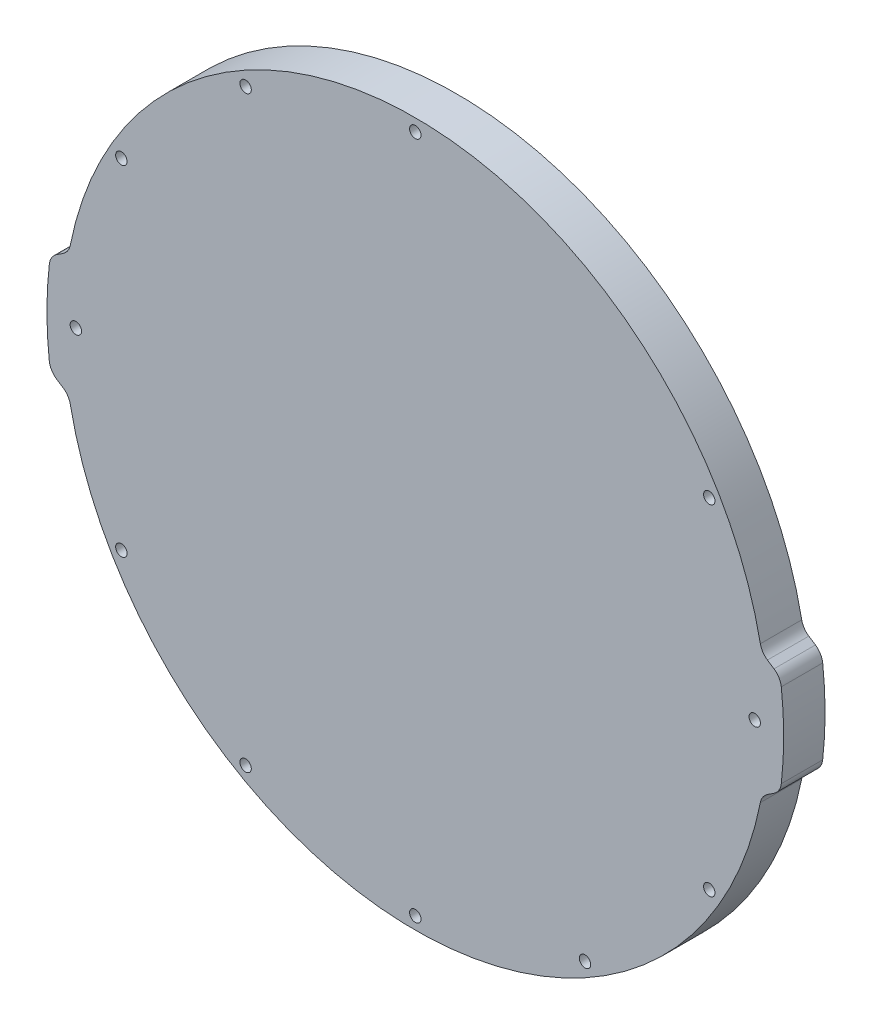
ISO-10303-21;
HEADER;
FILE_DESCRIPTION(('STEP AP214'),'2;1');
FILE_NAME('part.step','',(''),(''),'','','');
FILE_SCHEMA(('AUTOMOTIVE_DESIGN { 1 0 10303 214 1 1 1 1 }'));
ENDSEC;
DATA;
#1=APPLICATION_CONTEXT('core data for automotive mechanical design processes');
#2=APPLICATION_PROTOCOL_DEFINITION('international standard','automotive_design',2000,#1);
#3=PRODUCT_CONTEXT('',#1,'mechanical');
#4=PRODUCT('Part','Part','',(#3));
#5=PRODUCT_RELATED_PRODUCT_CATEGORY('part','',(#4));
#6=PRODUCT_DEFINITION_FORMATION('','',#4);
#7=PRODUCT_DEFINITION_CONTEXT('part definition',#1,'design');
#8=PRODUCT_DEFINITION('design','',#6,#7);
#9=PRODUCT_DEFINITION_SHAPE('','',#8);
#10=(LENGTH_UNIT() NAMED_UNIT(*) SI_UNIT(.MILLI.,.METRE.));
#11=(NAMED_UNIT(*) PLANE_ANGLE_UNIT() SI_UNIT($,.RADIAN.));
#12=(NAMED_UNIT(*) SI_UNIT($,.STERADIAN.) SOLID_ANGLE_UNIT());
#13=UNCERTAINTY_MEASURE_WITH_UNIT(LENGTH_MEASURE(1.E-05),#10,'distance_accuracy_value','');
#14=(GEOMETRIC_REPRESENTATION_CONTEXT(3) GLOBAL_UNCERTAINTY_ASSIGNED_CONTEXT((#13)) GLOBAL_UNIT_ASSIGNED_CONTEXT((#10,
#11,#12)) REPRESENTATION_CONTEXT('',''));
#15=CARTESIAN_POINT('',(0.,0.,0.));
#16=DIRECTION('',(0.,0.,1.));
#17=DIRECTION('',(1.,0.,0.));
#18=AXIS2_PLACEMENT_3D('',#15,#16,#17);
#19=CARTESIAN_POINT('',(-41.2570134560101,-62.1784177450905,6.35));
#20=DIRECTION('',(0.552887280799095,0.833256055921937,0.));
#21=DIRECTION('',(-0.833256055921937,0.552887280799095,0.));
#22=AXIS2_PLACEMENT_3D('',#19,#20,#21);
#23=PLANE('',#22);
#24=DIRECTION('',(0.833256055921937,-0.552887280799095,0.));
#25=VECTOR('',#24,1.);
#26=CARTESIAN_POINT('',(-41.2570134560101,-62.1784177450905,6.35));
#27=LINE('',#26,#25);
#28=CARTESIAN_POINT('',(-110.056160405221,-16.5283765510182,6.35));
#29=VERTEX_POINT('',#28);
#30=CARTESIAN_POINT('',(-108.039916516928,-17.8662073329294,6.35));
#31=VERTEX_POINT('',#30);
#32=EDGE_CURVE('E397',#29,#31,#27,.T.);
#33=ORIENTED_EDGE('',*,*,#32,.F.);
#34=DIRECTION('',(0.,0.,-1.));
#35=VECTOR('',#34,1.);
#36=CARTESIAN_POINT('',(-110.056160405221,-16.5283765510182,6.35));
#37=LINE('',#36,#35);
#38=CARTESIAN_POINT('',(-110.056160405221,-16.5283765510182,-6.35));
#39=VERTEX_POINT('',#38);
#40=EDGE_CURVE('E233',#29,#39,#37,.T.);
#41=ORIENTED_EDGE('',*,*,#40,.T.);
#42=DIRECTION('',(0.833256055921937,-0.552887280799095,0.));
#43=VECTOR('',#42,1.);
#44=CARTESIAN_POINT('',(-41.2570134560101,-62.1784177450905,-6.35));
#45=LINE('',#44,#43);
#46=CARTESIAN_POINT('',(-108.039916516928,-17.8662073329294,-6.35));
#47=VERTEX_POINT('',#46);
#48=EDGE_CURVE('E358',#39,#47,#45,.T.);
#49=ORIENTED_EDGE('',*,*,#48,.T.);
#50=DIRECTION('',(0.,0.,1.));
#51=VECTOR('',#50,1.);
#52=CARTESIAN_POINT('',(-108.039916516928,-17.8662073329294,6.35));
#53=LINE('',#52,#51);
#54=EDGE_CURVE('E230',#47,#31,#53,.T.);
#55=ORIENTED_EDGE('',*,*,#54,.T.);
#56=EDGE_LOOP('',(#33,#41,#49,#55));
#57=FACE_BOUND('',#56,.T.);
#58=ADVANCED_FACE('F43',(#57),#23,.F.);
#59=CARTESIAN_POINT('',(0.,0.,6.35));
#60=DIRECTION('',(0.,0.,-1.));
#61=DIRECTION('',(-1.,0.,0.));
#62=AXIS2_PLACEMENT_3D('',#59,#60,#61);
#63=CYLINDRICAL_SURFACE('',#62,107.95);
#64=CARTESIAN_POINT('',(0.,0.,6.35));
#65=DIRECTION('',(0.,0.,1.));
#66=DIRECTION('',(1.,0.,0.));
#67=AXIS2_PLACEMENT_3D('',#64,#65,#66);
#68=CIRCLE('',#67,107.95);
#69=CARTESIAN_POINT('',(-105.866625076269,-21.1059279578212,6.35));
#70=VERTEX_POINT('',#69);
#71=CARTESIAN_POINT('',(105.866625076269,-21.1059279578212,6.35));
#72=VERTEX_POINT('',#71);
#73=EDGE_CURVE('E391',#70,#72,#68,.T.);
#74=ORIENTED_EDGE('',*,*,#73,.F.);
#75=DIRECTION('',(0.,0.,-1.));
#76=VECTOR('',#75,1.);
#77=CARTESIAN_POINT('',(-105.866625076269,-21.1059279578212,6.35));
#78=LINE('',#77,#76);
#79=CARTESIAN_POINT('',(-105.866625076269,-21.1059279578212,-6.35));
#80=VERTEX_POINT('',#79);
#81=EDGE_CURVE('E240',#70,#80,#78,.T.);
#82=ORIENTED_EDGE('',*,*,#81,.T.);
#83=CARTESIAN_POINT('',(0.,0.,-6.35));
#84=DIRECTION('',(0.,0.,1.));
#85=DIRECTION('',(1.,0.,0.));
#86=AXIS2_PLACEMENT_3D('',#83,#84,#85);
#87=CIRCLE('',#86,107.95);
#88=CARTESIAN_POINT('',(105.866625076269,-21.1059279578212,-6.35));
#89=VERTEX_POINT('',#88);
#90=EDGE_CURVE('E362',#80,#89,#87,.T.);
#91=ORIENTED_EDGE('',*,*,#90,.T.);
#92=DIRECTION('',(0.,0.,-1.));
#93=VECTOR('',#92,1.);
#94=CARTESIAN_POINT('',(105.866625076269,-21.1059279578212,6.35));
#95=LINE('',#94,#93);
#96=EDGE_CURVE('E237',#89,#72,#95,.F.);
#97=ORIENTED_EDGE('',*,*,#96,.T.);
#98=EDGE_LOOP('',(#74,#82,#91,#97));
#99=FACE_BOUND('',#98,.T.);
#100=ADVANCED_FACE('F485',(#99),#63,.T.);
#101=CARTESIAN_POINT('',(41.2570134560101,-62.1784177450905,6.35));
#102=DIRECTION('',(0.552887280799095,-0.833256055921937,0.));
#103=DIRECTION('',(0.833256055921937,0.552887280799095,0.));
#104=AXIS2_PLACEMENT_3D('',#101,#102,#103);
#105=PLANE('',#104);
#106=DIRECTION('',(-0.833256055921937,-0.552887280799095,0.));
#107=VECTOR('',#106,1.);
#108=CARTESIAN_POINT('',(41.2570134560101,-62.1784177450905,-6.35));
#109=LINE('',#108,#107);
#110=CARTESIAN_POINT('',(110.056160405221,-16.5283765510182,-6.35));
#111=VERTEX_POINT('',#110);
#112=CARTESIAN_POINT('',(108.039916516928,-17.8662073329294,-6.35));
#113=VERTEX_POINT('',#112);
#114=EDGE_CURVE('E366',#111,#113,#109,.T.);
#115=ORIENTED_EDGE('',*,*,#114,.F.);
#116=DIRECTION('',(0.,0.,1.));
#117=VECTOR('',#116,1.);
#118=CARTESIAN_POINT('',(110.056160405221,-16.5283765510182,6.35));
#119=LINE('',#118,#117);
#120=CARTESIAN_POINT('',(110.056160405221,-16.5283765510182,6.35));
#121=VERTEX_POINT('',#120);
#122=EDGE_CURVE('E255',#111,#121,#119,.T.);
#123=ORIENTED_EDGE('',*,*,#122,.T.);
#124=DIRECTION('',(-0.833256055921937,-0.552887280799095,0.));
#125=VECTOR('',#124,1.);
#126=CARTESIAN_POINT('',(41.2570134560101,-62.1784177450905,6.35));
#127=LINE('',#126,#125);
#128=CARTESIAN_POINT('',(108.039916516928,-17.8662073329294,6.35));
#129=VERTEX_POINT('',#128);
#130=EDGE_CURVE('E388',#121,#129,#127,.T.);
#131=ORIENTED_EDGE('',*,*,#130,.T.);
#132=DIRECTION('',(0.,0.,-1.));
#133=VECTOR('',#132,1.);
#134=CARTESIAN_POINT('',(108.039916516928,-17.8662073329294,6.35));
#135=LINE('',#134,#133);
#136=EDGE_CURVE('E251',#129,#113,#135,.T.);
#137=ORIENTED_EDGE('',*,*,#136,.T.);
#138=EDGE_LOOP('',(#115,#123,#131,#137));
#139=FACE_BOUND('',#138,.T.);
#140=ADVANCED_FACE('F491',(#139),#105,.T.);
#141=CARTESIAN_POINT('',(0.,0.,6.35));
#142=DIRECTION('',(0.,0.,-1.));
#143=DIRECTION('',(-1.,0.,0.));
#144=AXIS2_PLACEMENT_3D('',#141,#142,#143);
#145=CYLINDRICAL_SURFACE('',#144,113.03);
#146=CARTESIAN_POINT('',(0.,0.,6.35));
#147=DIRECTION('',(0.,0.,1.));
#148=DIRECTION('',(1.,0.,0.));
#149=AXIS2_PLACEMENT_3D('',#146,#147,#148);
#150=CIRCLE('',#149,113.03);
#151=CARTESIAN_POINT('',(112.294433866704,-12.8740445298493,6.35));
#152=VERTEX_POINT('',#151);
#153=CARTESIAN_POINT('',(112.294433866704,12.8740445298493,6.35));
#154=VERTEX_POINT('',#153);
#155=EDGE_CURVE('E308',#152,#154,#150,.T.);
#156=ORIENTED_EDGE('',*,*,#155,.F.);
#157=DIRECTION('',(0.,0.,-1.));
#158=VECTOR('',#157,1.);
#159=CARTESIAN_POINT('',(112.294433866704,-12.8740445298493,6.35));
#160=LINE('',#159,#158);
#161=CARTESIAN_POINT('',(112.294433866704,-12.8740445298493,-6.35));
#162=VERTEX_POINT('',#161);
#163=EDGE_CURVE('E247',#152,#162,#160,.T.);
#164=ORIENTED_EDGE('',*,*,#163,.T.);
#165=CARTESIAN_POINT('',(0.,0.,-6.35));
#166=DIRECTION('',(0.,0.,1.));
#167=DIRECTION('',(1.,0.,0.));
#168=AXIS2_PLACEMENT_3D('',#165,#166,#167);
#169=CIRCLE('',#168,113.03);
#170=CARTESIAN_POINT('',(112.294433866704,12.8740445298493,-6.35));
#171=VERTEX_POINT('',#170);
#172=EDGE_CURVE('E295',#162,#171,#169,.T.);
#173=ORIENTED_EDGE('',*,*,#172,.T.);
#174=DIRECTION('',(0.,0.,-1.));
#175=VECTOR('',#174,1.);
#176=CARTESIAN_POINT('',(112.294433866704,12.8740445298493,6.35));
#177=LINE('',#176,#175);
#178=EDGE_CURVE('E244',#171,#154,#177,.F.);
#179=ORIENTED_EDGE('',*,*,#178,.T.);
#180=EDGE_LOOP('',(#156,#164,#173,#179));
#181=FACE_BOUND('',#180,.T.);
#182=ADVANCED_FACE('F377',(#181),#145,.T.);
#183=CARTESIAN_POINT('',(41.2570134560101,62.1784177450905,6.35));
#184=DIRECTION('',(-0.552887280799095,-0.833256055921937,0.));
#185=DIRECTION('',(0.833256055921937,-0.552887280799095,0.));
#186=AXIS2_PLACEMENT_3D('',#183,#184,#185);
#187=PLANE('',#186);
#188=DIRECTION('',(-0.833256055921937,0.552887280799095,0.));
#189=VECTOR('',#188,1.);
#190=CARTESIAN_POINT('',(41.2570134560101,62.1784177450905,6.35));
#191=LINE('',#190,#189);
#192=CARTESIAN_POINT('',(110.056160405221,16.5283765510182,6.35));
#193=VERTEX_POINT('',#192);
#194=CARTESIAN_POINT('',(108.039916516928,17.8662073329294,6.35));
#195=VERTEX_POINT('',#194);
#196=EDGE_CURVE('E302',#193,#195,#191,.T.);
#197=ORIENTED_EDGE('',*,*,#196,.F.);
#198=DIRECTION('',(0.,0.,-1.));
#199=VECTOR('',#198,1.);
#200=CARTESIAN_POINT('',(110.056160405221,16.5283765510182,6.35));
#201=LINE('',#200,#199);
#202=CARTESIAN_POINT('',(110.056160405221,16.5283765510182,-6.35));
#203=VERTEX_POINT('',#202);
#204=EDGE_CURVE('E261',#193,#203,#201,.T.);
#205=ORIENTED_EDGE('',*,*,#204,.T.);
#206=DIRECTION('',(-0.833256055921937,0.552887280799095,0.));
#207=VECTOR('',#206,1.);
#208=CARTESIAN_POINT('',(41.2570134560101,62.1784177450905,-6.35));
#209=LINE('',#208,#207);
#210=CARTESIAN_POINT('',(108.039916516928,17.8662073329294,-6.35));
#211=VERTEX_POINT('',#210);
#212=EDGE_CURVE('E286',#203,#211,#209,.T.);
#213=ORIENTED_EDGE('',*,*,#212,.T.);
#214=DIRECTION('',(0.,0.,1.));
#215=VECTOR('',#214,1.);
#216=CARTESIAN_POINT('',(108.039916516928,17.8662073329294,6.35));
#217=LINE('',#216,#215);
#218=EDGE_CURVE('E258',#211,#195,#217,.T.);
#219=ORIENTED_EDGE('',*,*,#218,.T.);
#220=EDGE_LOOP('',(#197,#205,#213,#219));
#221=FACE_BOUND('',#220,.T.);
#222=ADVANCED_FACE('F292',(#221),#187,.F.);
#223=CARTESIAN_POINT('',(0.,0.,6.35));
#224=DIRECTION('',(0.,0.,-1.));
#225=DIRECTION('',(-1.,0.,0.));
#226=AXIS2_PLACEMENT_3D('',#223,#224,#225);
#227=CYLINDRICAL_SURFACE('',#226,107.95);
#228=CARTESIAN_POINT('',(0.,0.,-6.35));
#229=DIRECTION('',(0.,0.,1.));
#230=DIRECTION('',(1.,0.,0.));
#231=AXIS2_PLACEMENT_3D('',#228,#229,#230);
#232=CIRCLE('',#231,107.95);
#233=CARTESIAN_POINT('',(105.866625076269,21.1059279578212,-6.35));
#234=VERTEX_POINT('',#233);
#235=CARTESIAN_POINT('',(-105.866625076269,21.1059279578212,-6.35));
#236=VERTEX_POINT('',#235);
#237=EDGE_CURVE('E194',#234,#236,#232,.T.);
#238=ORIENTED_EDGE('',*,*,#237,.T.);
#239=DIRECTION('',(0.,0.,-1.));
#240=VECTOR('',#239,1.);
#241=CARTESIAN_POINT('',(-105.866625076269,21.1059279578212,6.35));
#242=LINE('',#241,#240);
#243=CARTESIAN_POINT('',(-105.866625076269,21.1059279578212,6.35));
#244=VERTEX_POINT('',#243);
#245=EDGE_CURVE('E59',#236,#244,#242,.F.);
#246=ORIENTED_EDGE('',*,*,#245,.T.);
#247=CARTESIAN_POINT('',(0.,0.,6.35));
#248=DIRECTION('',(0.,0.,1.));
#249=DIRECTION('',(1.,0.,0.));
#250=AXIS2_PLACEMENT_3D('',#247,#248,#249);
#251=CIRCLE('',#250,107.95);
#252=CARTESIAN_POINT('',(105.866625076269,21.1059279578212,6.35));
#253=VERTEX_POINT('',#252);
#254=EDGE_CURVE('E298',#253,#244,#251,.T.);
#255=ORIENTED_EDGE('',*,*,#254,.F.);
#256=DIRECTION('',(0.,0.,-1.));
#257=VECTOR('',#256,1.);
#258=CARTESIAN_POINT('',(105.866625076269,21.1059279578212,6.35));
#259=LINE('',#258,#257);
#260=EDGE_CURVE('E224',#253,#234,#259,.T.);
#261=ORIENTED_EDGE('',*,*,#260,.T.);
#262=EDGE_LOOP('',(#238,#246,#255,#261));
#263=FACE_BOUND('',#262,.T.);
#264=ADVANCED_FACE('F297',(#263),#227,.T.);
#265=CARTESIAN_POINT('',(-41.2570134560101,62.1784177450905,6.35));
#266=DIRECTION('',(-0.552887280799095,0.833256055921937,0.));
#267=DIRECTION('',(-0.833256055921937,-0.552887280799095,0.));
#268=AXIS2_PLACEMENT_3D('',#265,#266,#267);
#269=PLANE('',#268);
#270=DIRECTION('',(0.833256055921937,0.552887280799095,0.));
#271=VECTOR('',#270,1.);
#272=CARTESIAN_POINT('',(-41.2570134560101,62.1784177450905,-6.35));
#273=LINE('',#272,#271);
#274=CARTESIAN_POINT('',(-110.056160405221,16.5283765510182,-6.35));
#275=VERTEX_POINT('',#274);
#276=CARTESIAN_POINT('',(-108.039916516928,17.8662073329294,-6.35));
#277=VERTEX_POINT('',#276);
#278=EDGE_CURVE('E187',#275,#277,#273,.T.);
#279=ORIENTED_EDGE('',*,*,#278,.F.);
#280=DIRECTION('',(0.,0.,1.));
#281=VECTOR('',#280,1.);
#282=CARTESIAN_POINT('',(-110.056160405221,16.5283765510182,6.35));
#283=LINE('',#282,#281);
#284=CARTESIAN_POINT('',(-110.056160405221,16.5283765510182,6.35));
#285=VERTEX_POINT('',#284);
#286=EDGE_CURVE('E162',#275,#285,#283,.T.);
#287=ORIENTED_EDGE('',*,*,#286,.T.);
#288=DIRECTION('',(0.833256055921937,0.552887280799095,0.));
#289=VECTOR('',#288,1.);
#290=CARTESIAN_POINT('',(-41.2570134560101,62.1784177450905,6.35));
#291=LINE('',#290,#289);
#292=CARTESIAN_POINT('',(-108.039916516928,17.8662073329294,6.35));
#293=VERTEX_POINT('',#292);
#294=EDGE_CURVE('E301',#285,#293,#291,.T.);
#295=ORIENTED_EDGE('',*,*,#294,.T.);
#296=DIRECTION('',(0.,0.,-1.));
#297=VECTOR('',#296,1.);
#298=CARTESIAN_POINT('',(-108.039916516928,17.8662073329294,6.35));
#299=LINE('',#298,#297);
#300=EDGE_CURVE('E168',#293,#277,#299,.T.);
#301=ORIENTED_EDGE('',*,*,#300,.T.);
#302=EDGE_LOOP('',(#279,#287,#295,#301));
#303=FACE_BOUND('',#302,.T.);
#304=ADVANCED_FACE('F470',(#303),#269,.T.);
#305=CARTESIAN_POINT('',(0.,104.14,6.35));
#306=DIRECTION('',(0.,0.,-1.));
#307=DIRECTION('',(-1.,0.,0.));
#308=AXIS2_PLACEMENT_3D('',#305,#306,#307);
#309=CYLINDRICAL_SURFACE('',#308,1.75);
#310=CARTESIAN_POINT('',(0.,104.14,6.35));
#311=DIRECTION('',(0.,0.,1.));
#312=DIRECTION('',(1.,0.,0.));
#313=AXIS2_PLACEMENT_3D('',#310,#311,#312);
#314=CIRCLE('',#313,1.75);
#315=CARTESIAN_POINT('',(1.74999999999998,104.14,6.35));
#316=VERTEX_POINT('',#315);
#317=EDGE_CURVE('E401',#316,#316,#314,.T.);
#318=ORIENTED_EDGE('',*,*,#317,.T.);
#319=EDGE_LOOP('',(#318));
#320=FACE_BOUND('',#319,.T.);
#321=CARTESIAN_POINT('',(0.,104.14,-6.35));
#322=DIRECTION('',(0.,0.,1.));
#323=DIRECTION('',(1.,0.,0.));
#324=AXIS2_PLACEMENT_3D('',#321,#322,#323);
#325=CIRCLE('',#324,1.75);
#326=CARTESIAN_POINT('',(1.74999999999998,104.14,-6.35));
#327=VERTEX_POINT('',#326);
#328=EDGE_CURVE('E354',#327,#327,#325,.T.);
#329=ORIENTED_EDGE('',*,*,#328,.F.);
#330=EDGE_LOOP('',(#329));
#331=FACE_BOUND('',#330,.T.);
#332=ADVANCED_FACE('F466',(#320,#331),#309,.F.);
#333=CARTESIAN_POINT('',(90.1878855501114,52.07,6.35));
#334=DIRECTION('',(0.,0.,-1.));
#335=DIRECTION('',(-1.,0.,0.));
#336=AXIS2_PLACEMENT_3D('',#333,#334,#335);
#337=CYLINDRICAL_SURFACE('',#336,1.75);
#338=CARTESIAN_POINT('',(90.1878855501114,52.07,6.35));
#339=DIRECTION('',(0.,0.,1.));
#340=DIRECTION('',(1.,0.,0.));
#341=AXIS2_PLACEMENT_3D('',#338,#339,#340);
#342=CIRCLE('',#341,1.75);
#343=CARTESIAN_POINT('',(91.9378855501114,52.07,6.35));
#344=VERTEX_POINT('',#343);
#345=EDGE_CURVE('E405',#344,#344,#342,.T.);
#346=ORIENTED_EDGE('',*,*,#345,.T.);
#347=EDGE_LOOP('',(#346));
#348=FACE_BOUND('',#347,.T.);
#349=CARTESIAN_POINT('',(90.1878855501114,52.07,-6.35));
#350=DIRECTION('',(0.,0.,1.));
#351=DIRECTION('',(1.,0.,0.));
#352=AXIS2_PLACEMENT_3D('',#349,#350,#351);
#353=CIRCLE('',#352,1.75);
#354=CARTESIAN_POINT('',(91.9378855501114,52.07,-6.35));
#355=VERTEX_POINT('',#354);
#356=EDGE_CURVE('E350',#355,#355,#353,.T.);
#357=ORIENTED_EDGE('',*,*,#356,.F.);
#358=EDGE_LOOP('',(#357));
#359=FACE_BOUND('',#358,.T.);
#360=ADVANCED_FACE('F469',(#348,#359),#337,.F.);
#361=CARTESIAN_POINT('',(104.14,0.,6.35));
#362=DIRECTION('',(0.,0.,-1.));
#363=DIRECTION('',(-1.,0.,0.));
#364=AXIS2_PLACEMENT_3D('',#361,#362,#363);
#365=CYLINDRICAL_SURFACE('',#364,1.75);
#366=CARTESIAN_POINT('',(104.14,0.,6.35));
#367=DIRECTION('',(0.,0.,1.));
#368=DIRECTION('',(1.,0.,0.));
#369=AXIS2_PLACEMENT_3D('',#366,#367,#368);
#370=CIRCLE('',#369,1.75);
#371=CARTESIAN_POINT('',(105.89,0.,6.35));
#372=VERTEX_POINT('',#371);
#373=EDGE_CURVE('E409',#372,#372,#370,.T.);
#374=ORIENTED_EDGE('',*,*,#373,.T.);
#375=EDGE_LOOP('',(#374));
#376=FACE_BOUND('',#375,.T.);
#377=CARTESIAN_POINT('',(104.14,0.,-6.35));
#378=DIRECTION('',(0.,0.,1.));
#379=DIRECTION('',(1.,0.,0.));
#380=AXIS2_PLACEMENT_3D('',#377,#378,#379);
#381=CIRCLE('',#380,1.75);
#382=CARTESIAN_POINT('',(105.89,0.,-6.35));
#383=VERTEX_POINT('',#382);
#384=EDGE_CURVE('E346',#383,#383,#381,.T.);
#385=ORIENTED_EDGE('',*,*,#384,.F.);
#386=EDGE_LOOP('',(#385));
#387=FACE_BOUND('',#386,.T.);
#388=ADVANCED_FACE('F499',(#376,#387),#365,.F.);
#389=CARTESIAN_POINT('',(90.1878855501114,-52.07,6.35));
#390=DIRECTION('',(0.,0.,-1.));
#391=DIRECTION('',(-1.,0.,0.));
#392=AXIS2_PLACEMENT_3D('',#389,#390,#391);
#393=CYLINDRICAL_SURFACE('',#392,1.74999999999998);
#394=CARTESIAN_POINT('',(90.1878855501114,-52.07,6.35));
#395=DIRECTION('',(0.,0.,1.));
#396=DIRECTION('',(1.,0.,0.));
#397=AXIS2_PLACEMENT_3D('',#394,#395,#396);
#398=CIRCLE('',#397,1.74999999999998);
#399=CARTESIAN_POINT('',(91.9378855501114,-52.07,6.35));
#400=VERTEX_POINT('',#399);
#401=EDGE_CURVE('E413',#400,#400,#398,.T.);
#402=ORIENTED_EDGE('',*,*,#401,.T.);
#403=EDGE_LOOP('',(#402));
#404=FACE_BOUND('',#403,.T.);
#405=CARTESIAN_POINT('',(90.1878855501114,-52.07,-6.35));
#406=DIRECTION('',(0.,0.,1.));
#407=DIRECTION('',(1.,0.,0.));
#408=AXIS2_PLACEMENT_3D('',#405,#406,#407);
#409=CIRCLE('',#408,1.74999999999998);
#410=CARTESIAN_POINT('',(91.9378855501114,-52.07,-6.35));
#411=VERTEX_POINT('',#410);
#412=EDGE_CURVE('E342',#411,#411,#409,.T.);
#413=ORIENTED_EDGE('',*,*,#412,.F.);
#414=EDGE_LOOP('',(#413));
#415=FACE_BOUND('',#414,.T.);
#416=ADVANCED_FACE('F503',(#404,#415),#393,.F.);
#417=CARTESIAN_POINT('',(52.07,-90.1878855501114,6.35));
#418=DIRECTION('',(0.,0.,-1.));
#419=DIRECTION('',(-1.,0.,0.));
#420=AXIS2_PLACEMENT_3D('',#417,#418,#419);
#421=CYLINDRICAL_SURFACE('',#420,1.75);
#422=CARTESIAN_POINT('',(52.07,-90.1878855501114,6.35));
#423=DIRECTION('',(0.,0.,1.));
#424=DIRECTION('',(1.,0.,0.));
#425=AXIS2_PLACEMENT_3D('',#422,#423,#424);
#426=CIRCLE('',#425,1.75);
#427=CARTESIAN_POINT('',(53.82,-90.1878855501114,6.35));
#428=VERTEX_POINT('',#427);
#429=EDGE_CURVE('E417',#428,#428,#426,.T.);
#430=ORIENTED_EDGE('',*,*,#429,.T.);
#431=EDGE_LOOP('',(#430));
#432=FACE_BOUND('',#431,.T.);
#433=CARTESIAN_POINT('',(52.07,-90.1878855501114,-6.35));
#434=DIRECTION('',(0.,0.,1.));
#435=DIRECTION('',(1.,0.,0.));
#436=AXIS2_PLACEMENT_3D('',#433,#434,#435);
#437=CIRCLE('',#436,1.75);
#438=CARTESIAN_POINT('',(53.82,-90.1878855501114,-6.35));
#439=VERTEX_POINT('',#438);
#440=EDGE_CURVE('E338',#439,#439,#437,.T.);
#441=ORIENTED_EDGE('',*,*,#440,.F.);
#442=EDGE_LOOP('',(#441));
#443=FACE_BOUND('',#442,.T.);
#444=ADVANCED_FACE('F507',(#432,#443),#421,.F.);
#445=CARTESIAN_POINT('',(0.,-104.14,6.35));
#446=DIRECTION('',(0.,0.,-1.));
#447=DIRECTION('',(-1.,0.,0.));
#448=AXIS2_PLACEMENT_3D('',#445,#446,#447);
#449=CYLINDRICAL_SURFACE('',#448,1.75);
#450=CARTESIAN_POINT('',(0.,-104.14,6.35));
#451=DIRECTION('',(0.,0.,1.));
#452=DIRECTION('',(1.,0.,0.));
#453=AXIS2_PLACEMENT_3D('',#450,#451,#452);
#454=CIRCLE('',#453,1.75);
#455=CARTESIAN_POINT('',(1.75000000000001,-104.14,6.35));
#456=VERTEX_POINT('',#455);
#457=EDGE_CURVE('E421',#456,#456,#454,.T.);
#458=ORIENTED_EDGE('',*,*,#457,.T.);
#459=EDGE_LOOP('',(#458));
#460=FACE_BOUND('',#459,.T.);
#461=CARTESIAN_POINT('',(0.,-104.14,-6.35));
#462=DIRECTION('',(0.,0.,1.));
#463=DIRECTION('',(1.,0.,0.));
#464=AXIS2_PLACEMENT_3D('',#461,#462,#463);
#465=CIRCLE('',#464,1.75);
#466=CARTESIAN_POINT('',(1.75000000000001,-104.14,-6.35));
#467=VERTEX_POINT('',#466);
#468=EDGE_CURVE('E334',#467,#467,#465,.T.);
#469=ORIENTED_EDGE('',*,*,#468,.F.);
#470=EDGE_LOOP('',(#469));
#471=FACE_BOUND('',#470,.T.);
#472=ADVANCED_FACE('F511',(#460,#471),#449,.F.);
#473=CARTESIAN_POINT('',(-52.07,-90.1878855501114,6.35));
#474=DIRECTION('',(0.,0.,-1.));
#475=DIRECTION('',(-1.,0.,0.));
#476=AXIS2_PLACEMENT_3D('',#473,#474,#475);
#477=CYLINDRICAL_SURFACE('',#476,1.75);
#478=CARTESIAN_POINT('',(-52.07,-90.1878855501114,6.35));
#479=DIRECTION('',(0.,0.,1.));
#480=DIRECTION('',(1.,0.,0.));
#481=AXIS2_PLACEMENT_3D('',#478,#479,#480);
#482=CIRCLE('',#481,1.75);
#483=CARTESIAN_POINT('',(-50.32,-90.1878855501114,6.35));
#484=VERTEX_POINT('',#483);
#485=EDGE_CURVE('E425',#484,#484,#482,.T.);
#486=ORIENTED_EDGE('',*,*,#485,.T.);
#487=EDGE_LOOP('',(#486));
#488=FACE_BOUND('',#487,.T.);
#489=CARTESIAN_POINT('',(-52.07,-90.1878855501114,-6.35));
#490=DIRECTION('',(0.,0.,1.));
#491=DIRECTION('',(1.,0.,0.));
#492=AXIS2_PLACEMENT_3D('',#489,#490,#491);
#493=CIRCLE('',#492,1.75);
#494=CARTESIAN_POINT('',(-50.32,-90.1878855501114,-6.35));
#495=VERTEX_POINT('',#494);
#496=EDGE_CURVE('E330',#495,#495,#493,.T.);
#497=ORIENTED_EDGE('',*,*,#496,.F.);
#498=EDGE_LOOP('',(#497));
#499=FACE_BOUND('',#498,.T.);
#500=ADVANCED_FACE('F515',(#488,#499),#477,.F.);
#501=CARTESIAN_POINT('',(-90.1878855501114,-52.07,6.35));
#502=DIRECTION('',(0.,0.,-1.));
#503=DIRECTION('',(-1.,0.,0.));
#504=AXIS2_PLACEMENT_3D('',#501,#502,#503);
#505=CYLINDRICAL_SURFACE('',#504,1.75);
#506=CARTESIAN_POINT('',(-90.1878855501114,-52.07,6.35));
#507=DIRECTION('',(0.,0.,1.));
#508=DIRECTION('',(1.,0.,0.));
#509=AXIS2_PLACEMENT_3D('',#506,#507,#508);
#510=CIRCLE('',#509,1.75);
#511=CARTESIAN_POINT('',(-88.4378855501114,-52.07,6.35));
#512=VERTEX_POINT('',#511);
#513=EDGE_CURVE('E429',#512,#512,#510,.T.);
#514=ORIENTED_EDGE('',*,*,#513,.T.);
#515=EDGE_LOOP('',(#514));
#516=FACE_BOUND('',#515,.T.);
#517=CARTESIAN_POINT('',(-90.1878855501114,-52.07,-6.35));
#518=DIRECTION('',(0.,0.,1.));
#519=DIRECTION('',(1.,0.,0.));
#520=AXIS2_PLACEMENT_3D('',#517,#518,#519);
#521=CIRCLE('',#520,1.75);
#522=CARTESIAN_POINT('',(-88.4378855501114,-52.07,-6.35));
#523=VERTEX_POINT('',#522);
#524=EDGE_CURVE('E326',#523,#523,#521,.T.);
#525=ORIENTED_EDGE('',*,*,#524,.F.);
#526=EDGE_LOOP('',(#525));
#527=FACE_BOUND('',#526,.T.);
#528=ADVANCED_FACE('F519',(#516,#527),#505,.F.);
#529=CARTESIAN_POINT('',(-104.14,0.,6.35));
#530=DIRECTION('',(0.,0.,-1.));
#531=DIRECTION('',(-1.,0.,0.));
#532=AXIS2_PLACEMENT_3D('',#529,#530,#531);
#533=CYLINDRICAL_SURFACE('',#532,1.75);
#534=CARTESIAN_POINT('',(-104.14,0.,6.35));
#535=DIRECTION('',(0.,0.,1.));
#536=DIRECTION('',(1.,0.,0.));
#537=AXIS2_PLACEMENT_3D('',#534,#535,#536);
#538=CIRCLE('',#537,1.75);
#539=CARTESIAN_POINT('',(-102.39,0.,6.35));
#540=VERTEX_POINT('',#539);
#541=EDGE_CURVE('E433',#540,#540,#538,.T.);
#542=ORIENTED_EDGE('',*,*,#541,.T.);
#543=EDGE_LOOP('',(#542));
#544=FACE_BOUND('',#543,.T.);
#545=CARTESIAN_POINT('',(-104.14,0.,-6.35));
#546=DIRECTION('',(0.,0.,1.));
#547=DIRECTION('',(1.,0.,0.));
#548=AXIS2_PLACEMENT_3D('',#545,#546,#547);
#549=CIRCLE('',#548,1.75);
#550=CARTESIAN_POINT('',(-102.39,0.,-6.35));
#551=VERTEX_POINT('',#550);
#552=EDGE_CURVE('E322',#551,#551,#549,.T.);
#553=ORIENTED_EDGE('',*,*,#552,.F.);
#554=EDGE_LOOP('',(#553));
#555=FACE_BOUND('',#554,.T.);
#556=ADVANCED_FACE('F523',(#544,#555),#533,.F.);
#557=CARTESIAN_POINT('',(-90.1878855501115,52.0699999999999,6.35));
#558=DIRECTION('',(0.,0.,-1.));
#559=DIRECTION('',(-1.,0.,0.));
#560=AXIS2_PLACEMENT_3D('',#557,#558,#559);
#561=CYLINDRICAL_SURFACE('',#560,1.74999999999998);
#562=CARTESIAN_POINT('',(-90.1878855501115,52.0699999999999,6.35));
#563=DIRECTION('',(0.,0.,1.));
#564=DIRECTION('',(1.,0.,0.));
#565=AXIS2_PLACEMENT_3D('',#562,#563,#564);
#566=CIRCLE('',#565,1.74999999999998);
#567=CARTESIAN_POINT('',(-88.4378855501115,52.0699999999999,6.35));
#568=VERTEX_POINT('',#567);
#569=EDGE_CURVE('E192',#568,#568,#566,.T.);
#570=ORIENTED_EDGE('',*,*,#569,.T.);
#571=EDGE_LOOP('',(#570));
#572=FACE_BOUND('',#571,.T.);
#573=CARTESIAN_POINT('',(-90.1878855501115,52.0699999999999,-6.35));
#574=DIRECTION('',(0.,0.,1.));
#575=DIRECTION('',(1.,0.,0.));
#576=AXIS2_PLACEMENT_3D('',#573,#574,#575);
#577=CIRCLE('',#576,1.74999999999998);
#578=CARTESIAN_POINT('',(-88.4378855501115,52.0699999999999,-6.35));
#579=VERTEX_POINT('',#578);
#580=EDGE_CURVE('E318',#579,#579,#577,.T.);
#581=ORIENTED_EDGE('',*,*,#580,.F.);
#582=EDGE_LOOP('',(#581));
#583=FACE_BOUND('',#582,.T.);
#584=ADVANCED_FACE('F441',(#572,#583),#561,.F.);
#585=CARTESIAN_POINT('',(-52.07,90.1878855501114,6.35));
#586=DIRECTION('',(0.,0.,-1.));
#587=DIRECTION('',(-1.,0.,0.));
#588=AXIS2_PLACEMENT_3D('',#585,#586,#587);
#589=CYLINDRICAL_SURFACE('',#588,1.75000000000001);
#590=CARTESIAN_POINT('',(-52.07,90.1878855501114,6.35));
#591=DIRECTION('',(0.,0.,1.));
#592=DIRECTION('',(1.,0.,0.));
#593=AXIS2_PLACEMENT_3D('',#590,#591,#592);
#594=CIRCLE('',#593,1.75000000000001);
#595=CARTESIAN_POINT('',(-50.32,90.1878855501114,6.35));
#596=VERTEX_POINT('',#595);
#597=EDGE_CURVE('E186',#596,#596,#594,.T.);
#598=ORIENTED_EDGE('',*,*,#597,.T.);
#599=EDGE_LOOP('',(#598));
#600=FACE_BOUND('',#599,.T.);
#601=CARTESIAN_POINT('',(-52.07,90.1878855501114,-6.35));
#602=DIRECTION('',(0.,0.,1.));
#603=DIRECTION('',(1.,0.,0.));
#604=AXIS2_PLACEMENT_3D('',#601,#602,#603);
#605=CIRCLE('',#604,1.75000000000001);
#606=CARTESIAN_POINT('',(-50.32,90.1878855501114,-6.35));
#607=VERTEX_POINT('',#606);
#608=EDGE_CURVE('E314',#607,#607,#605,.T.);
#609=ORIENTED_EDGE('',*,*,#608,.F.);
#610=EDGE_LOOP('',(#609));
#611=FACE_BOUND('',#610,.T.);
#612=ADVANCED_FACE('F530',(#600,#611),#589,.F.);
#613=CARTESIAN_POINT('',(0.,0.,6.35));
#614=DIRECTION('',(0.,0.,-1.));
#615=DIRECTION('',(-1.,0.,0.));
#616=AXIS2_PLACEMENT_3D('',#613,#614,#615);
#617=CYLINDRICAL_SURFACE('',#616,113.03);
#618=CARTESIAN_POINT('',(0.,0.,6.35));
#619=DIRECTION('',(0.,0.,1.));
#620=DIRECTION('',(1.,0.,0.));
#621=AXIS2_PLACEMENT_3D('',#618,#619,#620);
#622=CIRCLE('',#621,113.03);
#623=CARTESIAN_POINT('',(-112.294433866704,12.8740445298493,6.35));
#624=VERTEX_POINT('',#623);
#625=CARTESIAN_POINT('',(-112.294433866704,-12.8740445298493,6.35));
#626=VERTEX_POINT('',#625);
#627=EDGE_CURVE('E178',#624,#626,#622,.T.);
#628=ORIENTED_EDGE('',*,*,#627,.F.);
#629=DIRECTION('',(0.,0.,-1.));
#630=VECTOR('',#629,1.);
#631=CARTESIAN_POINT('',(-112.294433866704,12.8740445298493,6.35));
#632=LINE('',#631,#630);
#633=CARTESIAN_POINT('',(-112.294433866704,12.8740445298493,-6.35));
#634=VERTEX_POINT('',#633);
#635=EDGE_CURVE('E161',#624,#634,#632,.T.);
#636=ORIENTED_EDGE('',*,*,#635,.T.);
#637=CARTESIAN_POINT('',(0.,0.,-6.35));
#638=DIRECTION('',(0.,0.,1.));
#639=DIRECTION('',(1.,0.,0.));
#640=AXIS2_PLACEMENT_3D('',#637,#638,#639);
#641=CIRCLE('',#640,113.03);
#642=CARTESIAN_POINT('',(-112.294433866704,-12.8740445298493,-6.35));
#643=VERTEX_POINT('',#642);
#644=EDGE_CURVE('E175',#634,#643,#641,.T.);
#645=ORIENTED_EDGE('',*,*,#644,.T.);
#646=DIRECTION('',(0.,0.,-1.));
#647=VECTOR('',#646,1.);
#648=CARTESIAN_POINT('',(-112.294433866704,-12.8740445298493,6.35));
#649=LINE('',#648,#647);
#650=EDGE_CURVE('E181',#643,#626,#649,.F.);
#651=ORIENTED_EDGE('',*,*,#650,.T.);
#652=EDGE_LOOP('',(#628,#636,#645,#651));
#653=FACE_BOUND('',#652,.T.);
#654=ADVANCED_FACE('F174',(#653),#617,.T.);
#655=CARTESIAN_POINT('',(0.,0.,6.35));
#656=DIRECTION('',(0.,0.,1.));
#657=DIRECTION('',(1.,0.,0.));
#658=AXIS2_PLACEMENT_3D('',#655,#656,#657);
#659=PLANE('',#658);
#660=ORIENTED_EDGE('',*,*,#597,.F.);
#661=EDGE_LOOP('',(#660));
#662=FACE_BOUND('',#661,.T.);
#663=ORIENTED_EDGE('',*,*,#569,.F.);
#664=EDGE_LOOP('',(#663));
#665=FACE_BOUND('',#664,.T.);
#666=ORIENTED_EDGE('',*,*,#541,.F.);
#667=EDGE_LOOP('',(#666));
#668=FACE_BOUND('',#667,.T.);
#669=ORIENTED_EDGE('',*,*,#513,.F.);
#670=EDGE_LOOP('',(#669));
#671=FACE_BOUND('',#670,.T.);
#672=ORIENTED_EDGE('',*,*,#485,.F.);
#673=EDGE_LOOP('',(#672));
#674=FACE_BOUND('',#673,.T.);
#675=ORIENTED_EDGE('',*,*,#457,.F.);
#676=EDGE_LOOP('',(#675));
#677=FACE_BOUND('',#676,.T.);
#678=ORIENTED_EDGE('',*,*,#429,.F.);
#679=EDGE_LOOP('',(#678));
#680=FACE_BOUND('',#679,.T.);
#681=ORIENTED_EDGE('',*,*,#401,.F.);
#682=EDGE_LOOP('',(#681));
#683=FACE_BOUND('',#682,.T.);
#684=ORIENTED_EDGE('',*,*,#373,.F.);
#685=EDGE_LOOP('',(#684));
#686=FACE_BOUND('',#685,.T.);
#687=ORIENTED_EDGE('',*,*,#345,.F.);
#688=EDGE_LOOP('',(#687));
#689=FACE_BOUND('',#688,.T.);
#690=ORIENTED_EDGE('',*,*,#317,.F.);
#691=EDGE_LOOP('',(#690));
#692=FACE_BOUND('',#691,.T.);
#693=ORIENTED_EDGE('',*,*,#294,.F.);
#694=CARTESIAN_POINT('',(-107.247493018762,12.2954357869347,6.35));
#695=DIRECTION('',(0.,0.,1.));
#696=DIRECTION('',(1.,0.,0.));
#697=AXIS2_PLACEMENT_3D('',#694,#695,#696);
#698=CIRCLE('',#697,5.08);
#699=EDGE_CURVE('E221',#285,#624,#698,.T.);
#700=ORIENTED_EDGE('',*,*,#699,.T.);
#701=ORIENTED_EDGE('',*,*,#627,.T.);
#702=CARTESIAN_POINT('',(-107.247493018762,-12.2954357869347,6.35));
#703=DIRECTION('',(0.,0.,1.));
#704=DIRECTION('',(1.,0.,0.));
#705=AXIS2_PLACEMENT_3D('',#702,#703,#704);
#706=CIRCLE('',#705,5.08);
#707=EDGE_CURVE('E218',#626,#29,#706,.T.);
#708=ORIENTED_EDGE('',*,*,#707,.T.);
#709=ORIENTED_EDGE('',*,*,#32,.T.);
#710=CARTESIAN_POINT('',(-110.848583903387,-22.0991480970128,6.35));
#711=DIRECTION('',(0.,0.,1.));
#712=DIRECTION('',(1.,0.,0.));
#713=AXIS2_PLACEMENT_3D('',#710,#711,#712);
#714=CIRCLE('',#713,5.08);
#715=EDGE_CURVE('E274',#31,#70,#714,.F.);
#716=ORIENTED_EDGE('',*,*,#715,.T.);
#717=ORIENTED_EDGE('',*,*,#73,.T.);
#718=CARTESIAN_POINT('',(110.848583903387,-22.0991480970128,6.35));
#719=DIRECTION('',(0.,0.,1.));
#720=DIRECTION('',(1.,0.,0.));
#721=AXIS2_PLACEMENT_3D('',#718,#719,#720);
#722=CIRCLE('',#721,5.08);
#723=EDGE_CURVE('E280',#72,#129,#722,.F.);
#724=ORIENTED_EDGE('',*,*,#723,.T.);
#725=ORIENTED_EDGE('',*,*,#130,.F.);
#726=CARTESIAN_POINT('',(107.247493018762,-12.2954357869347,6.35));
#727=DIRECTION('',(0.,0.,1.));
#728=DIRECTION('',(1.,0.,0.));
#729=AXIS2_PLACEMENT_3D('',#726,#727,#728);
#730=CIRCLE('',#729,5.08);
#731=EDGE_CURVE('E215',#121,#152,#730,.T.);
#732=ORIENTED_EDGE('',*,*,#731,.T.);
#733=ORIENTED_EDGE('',*,*,#155,.T.);
#734=CARTESIAN_POINT('',(107.247493018762,12.2954357869347,6.35));
#735=DIRECTION('',(0.,0.,1.));
#736=DIRECTION('',(1.,0.,0.));
#737=AXIS2_PLACEMENT_3D('',#734,#735,#736);
#738=CIRCLE('',#737,5.08);
#739=EDGE_CURVE('E212',#154,#193,#738,.T.);
#740=ORIENTED_EDGE('',*,*,#739,.T.);
#741=ORIENTED_EDGE('',*,*,#196,.T.);
#742=CARTESIAN_POINT('',(110.848583903387,22.0991480970128,6.35));
#743=DIRECTION('',(0.,0.,1.));
#744=DIRECTION('',(1.,0.,0.));
#745=AXIS2_PLACEMENT_3D('',#742,#743,#744);
#746=CIRCLE('',#745,5.08);
#747=EDGE_CURVE('E11',#195,#253,#746,.F.);
#748=ORIENTED_EDGE('',*,*,#747,.T.);
#749=ORIENTED_EDGE('',*,*,#254,.T.);
#750=CARTESIAN_POINT('',(-110.848583903387,22.0991480970128,6.35));
#751=DIRECTION('',(0.,0.,1.));
#752=DIRECTION('',(1.,0.,0.));
#753=AXIS2_PLACEMENT_3D('',#750,#751,#752);
#754=CIRCLE('',#753,5.08);
#755=EDGE_CURVE('E268',#244,#293,#754,.F.);
#756=ORIENTED_EDGE('',*,*,#755,.T.);
#757=EDGE_LOOP('',(#693,#700,#701,#708,#709,#716,#717,#724,#725,#732,#733,#740,#741,#748,#749,#756));
#758=FACE_BOUND('',#757,.T.);
#759=ADVANCED_FACE('F384',(#662,#665,#668,#671,#674,#677,#680,#683,#686,#689,#692,#758),#659,.T.);
#760=CARTESIAN_POINT('',(0.,0.,-6.35));
#761=DIRECTION('',(0.,0.,1.));
#762=DIRECTION('',(1.,0.,0.));
#763=AXIS2_PLACEMENT_3D('',#760,#761,#762);
#764=PLANE('',#763);
#765=ORIENTED_EDGE('',*,*,#608,.T.);
#766=EDGE_LOOP('',(#765));
#767=FACE_BOUND('',#766,.T.);
#768=ORIENTED_EDGE('',*,*,#580,.T.);
#769=EDGE_LOOP('',(#768));
#770=FACE_BOUND('',#769,.T.);
#771=ORIENTED_EDGE('',*,*,#552,.T.);
#772=EDGE_LOOP('',(#771));
#773=FACE_BOUND('',#772,.T.);
#774=ORIENTED_EDGE('',*,*,#524,.T.);
#775=EDGE_LOOP('',(#774));
#776=FACE_BOUND('',#775,.T.);
#777=ORIENTED_EDGE('',*,*,#496,.T.);
#778=EDGE_LOOP('',(#777));
#779=FACE_BOUND('',#778,.T.);
#780=ORIENTED_EDGE('',*,*,#468,.T.);
#781=EDGE_LOOP('',(#780));
#782=FACE_BOUND('',#781,.T.);
#783=ORIENTED_EDGE('',*,*,#440,.T.);
#784=EDGE_LOOP('',(#783));
#785=FACE_BOUND('',#784,.T.);
#786=ORIENTED_EDGE('',*,*,#412,.T.);
#787=EDGE_LOOP('',(#786));
#788=FACE_BOUND('',#787,.T.);
#789=ORIENTED_EDGE('',*,*,#384,.T.);
#790=EDGE_LOOP('',(#789));
#791=FACE_BOUND('',#790,.T.);
#792=ORIENTED_EDGE('',*,*,#356,.T.);
#793=EDGE_LOOP('',(#792));
#794=FACE_BOUND('',#793,.T.);
#795=ORIENTED_EDGE('',*,*,#328,.T.);
#796=EDGE_LOOP('',(#795));
#797=FACE_BOUND('',#796,.T.);
#798=ORIENTED_EDGE('',*,*,#644,.F.);
#799=CARTESIAN_POINT('',(-107.247493018762,12.2954357869347,-6.35));
#800=DIRECTION('',(0.,0.,1.));
#801=DIRECTION('',(1.,0.,0.));
#802=AXIS2_PLACEMENT_3D('',#799,#800,#801);
#803=CIRCLE('',#802,5.08);
#804=EDGE_CURVE('E157',#634,#275,#803,.F.);
#805=ORIENTED_EDGE('',*,*,#804,.T.);
#806=ORIENTED_EDGE('',*,*,#278,.T.);
#807=CARTESIAN_POINT('',(-110.848583903387,22.0991480970128,-6.35));
#808=DIRECTION('',(0.,0.,1.));
#809=DIRECTION('',(1.,0.,0.));
#810=AXIS2_PLACEMENT_3D('',#807,#808,#809);
#811=CIRCLE('',#810,5.08);
#812=EDGE_CURVE('E265',#277,#236,#811,.T.);
#813=ORIENTED_EDGE('',*,*,#812,.T.);
#814=ORIENTED_EDGE('',*,*,#237,.F.);
#815=CARTESIAN_POINT('',(110.848583903387,22.0991480970128,-6.35));
#816=DIRECTION('',(0.,0.,1.));
#817=DIRECTION('',(1.,0.,0.));
#818=AXIS2_PLACEMENT_3D('',#815,#816,#817);
#819=CIRCLE('',#818,5.08);
#820=EDGE_CURVE('E52',#234,#211,#819,.T.);
#821=ORIENTED_EDGE('',*,*,#820,.T.);
#822=ORIENTED_EDGE('',*,*,#212,.F.);
#823=CARTESIAN_POINT('',(107.247493018762,12.2954357869347,-6.35));
#824=DIRECTION('',(0.,0.,1.));
#825=DIRECTION('',(1.,0.,0.));
#826=AXIS2_PLACEMENT_3D('',#823,#824,#825);
#827=CIRCLE('',#826,5.08);
#828=EDGE_CURVE('E180',#203,#171,#827,.F.);
#829=ORIENTED_EDGE('',*,*,#828,.T.);
#830=ORIENTED_EDGE('',*,*,#172,.F.);
#831=CARTESIAN_POINT('',(107.247493018762,-12.2954357869347,-6.35));
#832=DIRECTION('',(0.,0.,1.));
#833=DIRECTION('',(1.,0.,0.));
#834=AXIS2_PLACEMENT_3D('',#831,#832,#833);
#835=CIRCLE('',#834,5.08);
#836=EDGE_CURVE('E202',#162,#111,#835,.F.);
#837=ORIENTED_EDGE('',*,*,#836,.T.);
#838=ORIENTED_EDGE('',*,*,#114,.T.);
#839=CARTESIAN_POINT('',(110.848583903387,-22.0991480970128,-6.35));
#840=DIRECTION('',(0.,0.,1.));
#841=DIRECTION('',(1.,0.,0.));
#842=AXIS2_PLACEMENT_3D('',#839,#840,#841);
#843=CIRCLE('',#842,5.08);
#844=EDGE_CURVE('E277',#113,#89,#843,.T.);
#845=ORIENTED_EDGE('',*,*,#844,.T.);
#846=ORIENTED_EDGE('',*,*,#90,.F.);
#847=CARTESIAN_POINT('',(-110.848583903387,-22.0991480970128,-6.35));
#848=DIRECTION('',(0.,0.,1.));
#849=DIRECTION('',(1.,0.,0.));
#850=AXIS2_PLACEMENT_3D('',#847,#848,#849);
#851=CIRCLE('',#850,5.08);
#852=EDGE_CURVE('E271',#80,#47,#851,.T.);
#853=ORIENTED_EDGE('',*,*,#852,.T.);
#854=ORIENTED_EDGE('',*,*,#48,.F.);
#855=CARTESIAN_POINT('',(-107.247493018762,-12.2954357869347,-6.35));
#856=DIRECTION('',(0.,0.,1.));
#857=DIRECTION('',(1.,0.,0.));
#858=AXIS2_PLACEMENT_3D('',#855,#856,#857);
#859=CIRCLE('',#858,5.08);
#860=EDGE_CURVE('E169',#39,#643,#859,.F.);
#861=ORIENTED_EDGE('',*,*,#860,.T.);
#862=EDGE_LOOP('',(#798,#805,#806,#813,#814,#821,#822,#829,#830,#837,#838,#845,#846,#853,#854,#861));
#863=FACE_BOUND('',#862,.T.);
#864=ADVANCED_FACE('F183',(#767,#770,#773,#776,#779,#782,#785,#788,#791,#794,#797,#863),#764,.F.);
#865=CARTESIAN_POINT('',(-107.247493018762,12.2954357869347,6.35));
#866=DIRECTION('',(0.,0.,-1.));
#867=DIRECTION('',(-1.,0.,0.));
#868=AXIS2_PLACEMENT_3D('',#865,#866,#867);
#869=CYLINDRICAL_SURFACE('',#868,5.08);
#870=ORIENTED_EDGE('',*,*,#699,.F.);
#871=ORIENTED_EDGE('',*,*,#286,.F.);
#872=ORIENTED_EDGE('',*,*,#804,.F.);
#873=ORIENTED_EDGE('',*,*,#635,.F.);
#874=EDGE_LOOP('',(#870,#871,#872,#873));
#875=FACE_BOUND('',#874,.T.);
#876=ADVANCED_FACE('F160',(#875),#869,.T.);
#877=CARTESIAN_POINT('',(-110.848583903387,22.0991480970128,6.35));
#878=DIRECTION('',(0.,0.,-1.));
#879=DIRECTION('',(-1.,0.,0.));
#880=AXIS2_PLACEMENT_3D('',#877,#878,#879);
#881=CYLINDRICAL_SURFACE('',#880,5.08);
#882=ORIENTED_EDGE('',*,*,#755,.F.);
#883=ORIENTED_EDGE('',*,*,#245,.F.);
#884=ORIENTED_EDGE('',*,*,#812,.F.);
#885=ORIENTED_EDGE('',*,*,#300,.F.);
#886=EDGE_LOOP('',(#882,#883,#884,#885));
#887=FACE_BOUND('',#886,.T.);
#888=ADVANCED_FACE('F480',(#887),#881,.F.);
#889=CARTESIAN_POINT('',(-107.247493018762,-12.2954357869347,6.35));
#890=DIRECTION('',(0.,0.,-1.));
#891=DIRECTION('',(-1.,0.,0.));
#892=AXIS2_PLACEMENT_3D('',#889,#890,#891);
#893=CYLINDRICAL_SURFACE('',#892,5.08);
#894=ORIENTED_EDGE('',*,*,#707,.F.);
#895=ORIENTED_EDGE('',*,*,#650,.F.);
#896=ORIENTED_EDGE('',*,*,#860,.F.);
#897=ORIENTED_EDGE('',*,*,#40,.F.);
#898=EDGE_LOOP('',(#894,#895,#896,#897));
#899=FACE_BOUND('',#898,.T.);
#900=ADVANCED_FACE('F536',(#899),#893,.T.);
#901=CARTESIAN_POINT('',(-110.848583903387,-22.0991480970128,6.35));
#902=DIRECTION('',(0.,0.,-1.));
#903=DIRECTION('',(-1.,0.,0.));
#904=AXIS2_PLACEMENT_3D('',#901,#902,#903);
#905=CYLINDRICAL_SURFACE('',#904,5.08);
#906=ORIENTED_EDGE('',*,*,#715,.F.);
#907=ORIENTED_EDGE('',*,*,#54,.F.);
#908=ORIENTED_EDGE('',*,*,#852,.F.);
#909=ORIENTED_EDGE('',*,*,#81,.F.);
#910=EDGE_LOOP('',(#906,#907,#908,#909));
#911=FACE_BOUND('',#910,.T.);
#912=ADVANCED_FACE('F540',(#911),#905,.F.);
#913=CARTESIAN_POINT('',(107.247493018762,-12.2954357869347,6.35));
#914=DIRECTION('',(0.,0.,-1.));
#915=DIRECTION('',(-1.,0.,0.));
#916=AXIS2_PLACEMENT_3D('',#913,#914,#915);
#917=CYLINDRICAL_SURFACE('',#916,5.08);
#918=ORIENTED_EDGE('',*,*,#731,.F.);
#919=ORIENTED_EDGE('',*,*,#122,.F.);
#920=ORIENTED_EDGE('',*,*,#836,.F.);
#921=ORIENTED_EDGE('',*,*,#163,.F.);
#922=EDGE_LOOP('',(#918,#919,#920,#921));
#923=FACE_BOUND('',#922,.T.);
#924=ADVANCED_FACE('F544',(#923),#917,.T.);
#925=CARTESIAN_POINT('',(110.848583903387,-22.0991480970128,6.35));
#926=DIRECTION('',(0.,0.,-1.));
#927=DIRECTION('',(-1.,0.,0.));
#928=AXIS2_PLACEMENT_3D('',#925,#926,#927);
#929=CYLINDRICAL_SURFACE('',#928,5.08);
#930=ORIENTED_EDGE('',*,*,#723,.F.);
#931=ORIENTED_EDGE('',*,*,#96,.F.);
#932=ORIENTED_EDGE('',*,*,#844,.F.);
#933=ORIENTED_EDGE('',*,*,#136,.F.);
#934=EDGE_LOOP('',(#930,#931,#932,#933));
#935=FACE_BOUND('',#934,.T.);
#936=ADVANCED_FACE('F548',(#935),#929,.F.);
#937=CARTESIAN_POINT('',(107.247493018762,12.2954357869347,6.35));
#938=DIRECTION('',(0.,0.,-1.));
#939=DIRECTION('',(-1.,0.,0.));
#940=AXIS2_PLACEMENT_3D('',#937,#938,#939);
#941=CYLINDRICAL_SURFACE('',#940,5.08);
#942=ORIENTED_EDGE('',*,*,#739,.F.);
#943=ORIENTED_EDGE('',*,*,#178,.F.);
#944=ORIENTED_EDGE('',*,*,#828,.F.);
#945=ORIENTED_EDGE('',*,*,#204,.F.);
#946=EDGE_LOOP('',(#942,#943,#944,#945));
#947=FACE_BOUND('',#946,.T.);
#948=ADVANCED_FACE('F382',(#947),#941,.T.);
#949=CARTESIAN_POINT('',(110.848583903387,22.0991480970128,6.35));
#950=DIRECTION('',(0.,0.,-1.));
#951=DIRECTION('',(-1.,0.,0.));
#952=AXIS2_PLACEMENT_3D('',#949,#950,#951);
#953=CYLINDRICAL_SURFACE('',#952,5.08);
#954=ORIENTED_EDGE('',*,*,#747,.F.);
#955=ORIENTED_EDGE('',*,*,#218,.F.);
#956=ORIENTED_EDGE('',*,*,#820,.F.);
#957=ORIENTED_EDGE('',*,*,#260,.F.);
#958=EDGE_LOOP('',(#954,#955,#956,#957));
#959=FACE_BOUND('',#958,.T.);
#960=ADVANCED_FACE('F45',(#959),#953,.F.);
#961=CLOSED_SHELL('',(#58,#100,#140,#182,#222,#264,#304,#332,#360,#388,#416,#444,#472,#500,#528,
#556,#584,#612,#654,#759,#864,#876,#888,#900,#912,#924,#936,#948,#960));
#962=MANIFOLD_SOLID_BREP('B2',#961);
#963=ADVANCED_BREP_SHAPE_REPRESENTATION('',(#18,#962),#14);
#964=SHAPE_DEFINITION_REPRESENTATION(#9,#963);
ENDSEC;
END-ISO-10303-21;
